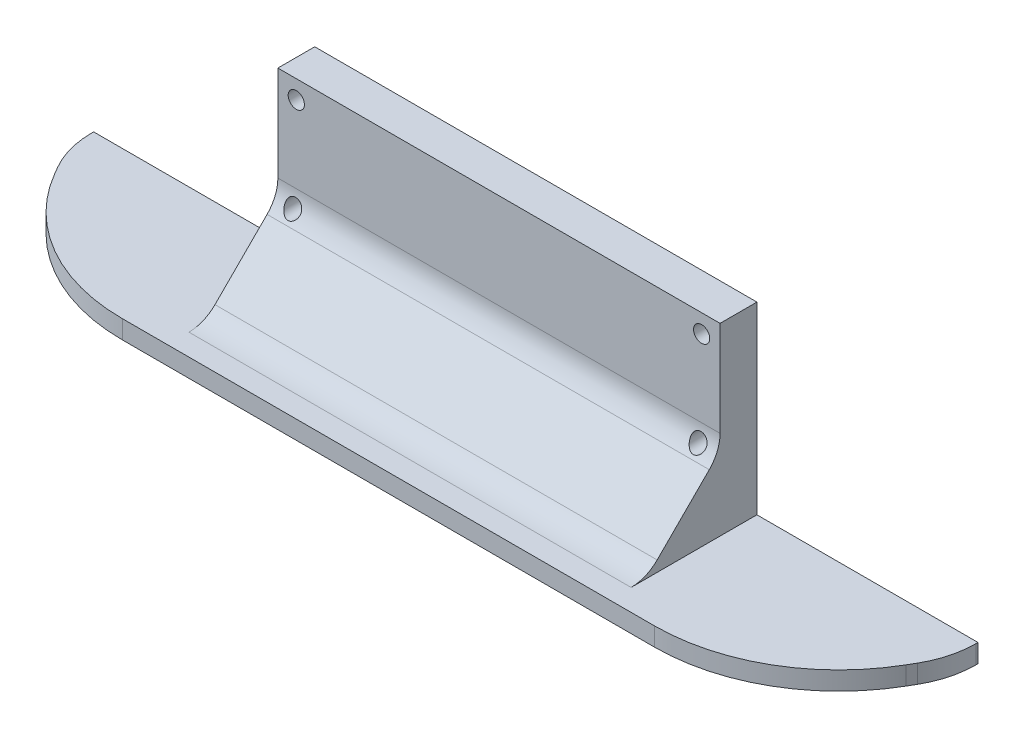
ISO-10303-21;
HEADER;
FILE_DESCRIPTION(('STEP AP214'),'2;1');
FILE_NAME('part.step','',(''),(''),'','','');
FILE_SCHEMA(('AUTOMOTIVE_DESIGN { 1 0 10303 214 1 1 1 1 }'));
ENDSEC;
DATA;
#1=APPLICATION_CONTEXT('core data for automotive mechanical design processes');
#2=APPLICATION_PROTOCOL_DEFINITION('international standard','automotive_design',2000,#1);
#3=PRODUCT_CONTEXT('',#1,'mechanical');
#4=PRODUCT('Part','Part','',(#3));
#5=PRODUCT_RELATED_PRODUCT_CATEGORY('part','',(#4));
#6=PRODUCT_DEFINITION_FORMATION('','',#4);
#7=PRODUCT_DEFINITION_CONTEXT('part definition',#1,'design');
#8=PRODUCT_DEFINITION('design','',#6,#7);
#9=PRODUCT_DEFINITION_SHAPE('','',#8);
#10=(LENGTH_UNIT() NAMED_UNIT(*) SI_UNIT(.MILLI.,.METRE.));
#11=(NAMED_UNIT(*) PLANE_ANGLE_UNIT() SI_UNIT($,.RADIAN.));
#12=(NAMED_UNIT(*) SI_UNIT($,.STERADIAN.) SOLID_ANGLE_UNIT());
#13=UNCERTAINTY_MEASURE_WITH_UNIT(LENGTH_MEASURE(1.E-05),#10,'distance_accuracy_value','');
#14=(GEOMETRIC_REPRESENTATION_CONTEXT(3) GLOBAL_UNCERTAINTY_ASSIGNED_CONTEXT((#13)) GLOBAL_UNIT_ASSIGNED_CONTEXT((#10,
#11,#12)) REPRESENTATION_CONTEXT('',''));
#15=CARTESIAN_POINT('',(0.,0.,0.));
#16=DIRECTION('',(0.,0.,1.));
#17=DIRECTION('',(1.,0.,0.));
#18=AXIS2_PLACEMENT_3D('',#15,#16,#17);
#19=CARTESIAN_POINT('',(0.,5.,0.));
#20=DIRECTION('',(0.,-1.,0.));
#21=DIRECTION('',(0.,0.,-1.));
#22=AXIS2_PLACEMENT_3D('',#19,#20,#21);
#23=PLANE('',#22);
#24=DIRECTION('',(1.,0.,0.));
#25=VECTOR('',#24,1.);
#26=CARTESIAN_POINT('',(-120.,5.,20.));
#27=LINE('',#26,#25);
#28=CARTESIAN_POINT('',(-72.2158524499378,5.,20.));
#29=VERTEX_POINT('',#28);
#30=CARTESIAN_POINT('',(72.2158524499378,5.,20.));
#31=VERTEX_POINT('',#30);
#32=EDGE_CURVE('E199',#29,#31,#27,.T.);
#33=ORIENTED_EDGE('',*,*,#32,.T.);
#34=CARTESIAN_POINT('',(72.2158524499379,5.,-30.));
#35=DIRECTION('',(0.,-1.,0.));
#36=DIRECTION('',(0.,0.,-1.));
#37=AXIS2_PLACEMENT_3D('',#34,#35,#36);
#38=CIRCLE('',#37,50.);
#39=CARTESIAN_POINT('',(115.51712263916,5.,-4.99999999999977));
#40=VERTEX_POINT('',#39);
#41=EDGE_CURVE('E385',#31,#40,#38,.F.);
#42=ORIENTED_EDGE('',*,*,#41,.T.);
#43=DIRECTION('',(-0.500000000000005,0.,0.866025403784436));
#44=VECTOR('',#43,1.);
#45=CARTESIAN_POINT('',(120.,5.,-12.7645713530755));
#46=LINE('',#45,#44);
#47=CARTESIAN_POINT('',(116.650635094611,5.,-6.96330116385355));
#48=VERTEX_POINT('',#47);
#49=EDGE_CURVE('E357',#40,#48,#46,.F.);
#50=ORIENTED_EDGE('',*,*,#49,.T.);
#51=CARTESIAN_POINT('',(95.0000000000001,5.,-19.4633011638537));
#52=DIRECTION('',(0.,-1.,0.));
#53=DIRECTION('',(0.,0.,-1.));
#54=AXIS2_PLACEMENT_3D('',#51,#52,#53);
#55=CIRCLE('',#54,25.);
#56=CARTESIAN_POINT('',(120.,5.,-19.4633011638537));
#57=VERTEX_POINT('',#56);
#58=EDGE_CURVE('E347',#48,#57,#55,.F.);
#59=ORIENTED_EDGE('',*,*,#58,.T.);
#60=DIRECTION('',(0.,0.,-1.));
#61=VECTOR('',#60,1.);
#62=CARTESIAN_POINT('',(120.,5.,20.));
#63=LINE('',#62,#61);
#64=CARTESIAN_POINT('',(120.,5.,-20.));
#65=VERTEX_POINT('',#64);
#66=EDGE_CURVE('E190',#57,#65,#63,.T.);
#67=ORIENTED_EDGE('',*,*,#66,.T.);
#68=DIRECTION('',(-1.,0.,0.));
#69=VECTOR('',#68,1.);
#70=CARTESIAN_POINT('',(-120.,5.,-20.));
#71=LINE('',#70,#69);
#72=CARTESIAN_POINT('',(60.,5.,-20.));
#73=VERTEX_POINT('',#72);
#74=EDGE_CURVE('E194',#65,#73,#71,.T.);
#75=ORIENTED_EDGE('',*,*,#74,.T.);
#76=DIRECTION('',(0.,0.,-1.));
#77=VECTOR('',#76,1.);
#78=CARTESIAN_POINT('',(60.,5.,-20.));
#79=LINE('',#78,#77);
#80=CARTESIAN_POINT('',(60.,5.,14.142135623731));
#81=VERTEX_POINT('',#80);
#82=EDGE_CURVE('E176',#81,#73,#79,.T.);
#83=ORIENTED_EDGE('',*,*,#82,.F.);
#84=DIRECTION('',(1.,0.,0.));
#85=VECTOR('',#84,1.);
#86=CARTESIAN_POINT('',(-60.,5.,14.142135623731));
#87=LINE('',#86,#85);
#88=CARTESIAN_POINT('',(-60.,5.,14.142135623731));
#89=VERTEX_POINT('',#88);
#90=EDGE_CURVE('E219',#81,#89,#87,.F.);
#91=ORIENTED_EDGE('',*,*,#90,.T.);
#92=DIRECTION('',(0.,0.,1.));
#93=VECTOR('',#92,1.);
#94=CARTESIAN_POINT('',(-60.,5.,-20.));
#95=LINE('',#94,#93);
#96=CARTESIAN_POINT('',(-60.,5.,-20.));
#97=VERTEX_POINT('',#96);
#98=EDGE_CURVE('E336',#97,#89,#95,.T.);
#99=ORIENTED_EDGE('',*,*,#98,.F.);
#100=CARTESIAN_POINT('',(-120.,5.,-20.));
#101=VERTEX_POINT('',#100);
#102=EDGE_CURVE('E192',#97,#101,#71,.T.);
#103=ORIENTED_EDGE('',*,*,#102,.T.);
#104=DIRECTION('',(0.,0.,1.));
#105=VECTOR('',#104,1.);
#106=CARTESIAN_POINT('',(-120.,5.,20.));
#107=LINE('',#106,#105);
#108=CARTESIAN_POINT('',(-120.,5.,-19.4633011638537));
#109=VERTEX_POINT('',#108);
#110=EDGE_CURVE('E196',#101,#109,#107,.T.);
#111=ORIENTED_EDGE('',*,*,#110,.T.);
#112=CARTESIAN_POINT('',(-95.,5.,-19.4633011638537));
#113=DIRECTION('',(0.,-1.,0.));
#114=DIRECTION('',(0.,0.,-1.));
#115=AXIS2_PLACEMENT_3D('',#112,#113,#114);
#116=CIRCLE('',#115,25.);
#117=CARTESIAN_POINT('',(-116.650635094611,5.,-6.96330116385371));
#118=VERTEX_POINT('',#117);
#119=EDGE_CURVE('E368',#109,#118,#116,.F.);
#120=ORIENTED_EDGE('',*,*,#119,.T.);
#121=DIRECTION('',(-0.500000000000001,0.,-0.866025403784438));
#122=VECTOR('',#121,1.);
#123=CARTESIAN_POINT('',(-120.,5.,-12.7645713530757));
#124=LINE('',#123,#122);
#125=CARTESIAN_POINT('',(-115.51712263916,5.,-4.99999999999993));
#126=VERTEX_POINT('',#125);
#127=EDGE_CURVE('E360',#118,#126,#124,.F.);
#128=ORIENTED_EDGE('',*,*,#127,.T.);
#129=CARTESIAN_POINT('',(-72.2158524499377,5.,-30.));
#130=DIRECTION('',(0.,-1.,0.));
#131=DIRECTION('',(0.,0.,-1.));
#132=AXIS2_PLACEMENT_3D('',#129,#130,#131);
#133=CIRCLE('',#132,50.);
#134=EDGE_CURVE('E383',#126,#29,#133,.F.);
#135=ORIENTED_EDGE('',*,*,#134,.T.);
#136=EDGE_LOOP('',(#33,#42,#50,#59,#67,#75,#83,#91,#99,#103,#111,#120,#128,#135));
#137=FACE_BOUND('',#136,.T.);
#138=ADVANCED_FACE('F35',(#137),#23,.F.);
#139=CARTESIAN_POINT('',(120.,5.,20.));
#140=DIRECTION('',(-1.,0.,0.));
#141=DIRECTION('',(0.,0.,1.));
#142=AXIS2_PLACEMENT_3D('',#139,#140,#141);
#143=PLANE('',#142);
#144=ORIENTED_EDGE('',*,*,#66,.F.);
#145=DIRECTION('',(0.,1.,0.));
#146=VECTOR('',#145,1.);
#147=CARTESIAN_POINT('',(120.,0.,-19.4633011638537));
#148=LINE('',#147,#146);
#149=CARTESIAN_POINT('',(120.,0.,-19.4633011638537));
#150=VERTEX_POINT('',#149);
#151=EDGE_CURVE('E350',#57,#150,#148,.F.);
#152=ORIENTED_EDGE('',*,*,#151,.T.);
#153=DIRECTION('',(0.,0.,-1.));
#154=VECTOR('',#153,1.);
#155=CARTESIAN_POINT('',(120.,0.,20.));
#156=LINE('',#155,#154);
#157=CARTESIAN_POINT('',(120.,0.,-20.));
#158=VERTEX_POINT('',#157);
#159=EDGE_CURVE('E182',#150,#158,#156,.T.);
#160=ORIENTED_EDGE('',*,*,#159,.T.);
#161=DIRECTION('',(0.,-1.,0.));
#162=VECTOR('',#161,1.);
#163=CARTESIAN_POINT('',(120.,5.,-20.));
#164=LINE('',#163,#162);
#165=EDGE_CURVE('E211',#65,#158,#164,.T.);
#166=ORIENTED_EDGE('',*,*,#165,.F.);
#167=EDGE_LOOP('',(#144,#152,#160,#166));
#168=FACE_BOUND('',#167,.T.);
#169=ADVANCED_FACE('F289',(#168),#143,.F.);
#170=CARTESIAN_POINT('',(-120.,5.,-20.));
#171=DIRECTION('',(0.,0.,1.));
#172=DIRECTION('',(1.,0.,0.));
#173=AXIS2_PLACEMENT_3D('',#170,#171,#172);
#174=PLANE('',#173);
#175=CARTESIAN_POINT('',(55.,50.,-20.));
#176=DIRECTION('',(0.,0.,1.));
#177=DIRECTION('',(1.,0.,0.));
#178=AXIS2_PLACEMENT_3D('',#175,#176,#177);
#179=CIRCLE('',#178,2.2);
#180=CARTESIAN_POINT('',(57.2,50.,-20.));
#181=VERTEX_POINT('',#180);
#182=EDGE_CURVE('E583',#181,#181,#179,.T.);
#183=ORIENTED_EDGE('',*,*,#182,.T.);
#184=EDGE_LOOP('',(#183));
#185=FACE_BOUND('',#184,.T.);
#186=CARTESIAN_POINT('',(-55.,25.,-20.));
#187=DIRECTION('',(0.,0.,1.));
#188=DIRECTION('',(1.,0.,0.));
#189=AXIS2_PLACEMENT_3D('',#186,#187,#188);
#190=CIRCLE('',#189,2.2);
#191=CARTESIAN_POINT('',(-52.8,25.,-20.));
#192=VERTEX_POINT('',#191);
#193=EDGE_CURVE('E584',#192,#192,#190,.T.);
#194=ORIENTED_EDGE('',*,*,#193,.T.);
#195=EDGE_LOOP('',(#194));
#196=FACE_BOUND('',#195,.T.);
#197=CARTESIAN_POINT('',(55.,25.,-20.));
#198=DIRECTION('',(0.,0.,1.));
#199=DIRECTION('',(1.,0.,0.));
#200=AXIS2_PLACEMENT_3D('',#197,#198,#199);
#201=CIRCLE('',#200,2.2);
#202=CARTESIAN_POINT('',(57.2,25.,-20.));
#203=VERTEX_POINT('',#202);
#204=EDGE_CURVE('E587',#203,#203,#201,.T.);
#205=ORIENTED_EDGE('',*,*,#204,.T.);
#206=EDGE_LOOP('',(#205));
#207=FACE_BOUND('',#206,.T.);
#208=CARTESIAN_POINT('',(-55.,50.,-20.));
#209=DIRECTION('',(0.,0.,1.));
#210=DIRECTION('',(1.,0.,0.));
#211=AXIS2_PLACEMENT_3D('',#208,#209,#210);
#212=CIRCLE('',#211,2.2);
#213=CARTESIAN_POINT('',(-52.8,50.,-20.));
#214=VERTEX_POINT('',#213);
#215=EDGE_CURVE('E246',#214,#214,#212,.T.);
#216=ORIENTED_EDGE('',*,*,#215,.T.);
#217=EDGE_LOOP('',(#216));
#218=FACE_BOUND('',#217,.T.);
#219=DIRECTION('',(-1.,0.,0.));
#220=VECTOR('',#219,1.);
#221=CARTESIAN_POINT('',(-120.,0.,-20.));
#222=LINE('',#221,#220);
#223=CARTESIAN_POINT('',(-120.,0.,-20.));
#224=VERTEX_POINT('',#223);
#225=EDGE_CURVE('E184',#158,#224,#222,.T.);
#226=ORIENTED_EDGE('',*,*,#225,.T.);
#227=DIRECTION('',(0.,-1.,0.));
#228=VECTOR('',#227,1.);
#229=CARTESIAN_POINT('',(-120.,5.,-20.));
#230=LINE('',#229,#228);
#231=EDGE_CURVE('E201',#101,#224,#230,.T.);
#232=ORIENTED_EDGE('',*,*,#231,.F.);
#233=ORIENTED_EDGE('',*,*,#102,.F.);
#234=DIRECTION('',(0.,-1.,0.));
#235=VECTOR('',#234,1.);
#236=CARTESIAN_POINT('',(-60.,55.,-20.));
#237=LINE('',#236,#235);
#238=CARTESIAN_POINT('',(-60.,55.,-20.));
#239=VERTEX_POINT('',#238);
#240=EDGE_CURVE('E333',#239,#97,#237,.T.);
#241=ORIENTED_EDGE('',*,*,#240,.F.);
#242=DIRECTION('',(-1.,0.,0.));
#243=VECTOR('',#242,1.);
#244=CARTESIAN_POINT('',(-60.,55.,-20.));
#245=LINE('',#244,#243);
#246=CARTESIAN_POINT('',(60.,55.,-20.));
#247=VERTEX_POINT('',#246);
#248=EDGE_CURVE('E172',#247,#239,#245,.T.);
#249=ORIENTED_EDGE('',*,*,#248,.F.);
#250=DIRECTION('',(0.,-1.,0.));
#251=VECTOR('',#250,1.);
#252=CARTESIAN_POINT('',(60.,55.,-20.));
#253=LINE('',#252,#251);
#254=EDGE_CURVE('E186',#247,#73,#253,.T.);
#255=ORIENTED_EDGE('',*,*,#254,.T.);
#256=ORIENTED_EDGE('',*,*,#74,.F.);
#257=ORIENTED_EDGE('',*,*,#165,.T.);
#258=EDGE_LOOP('',(#226,#232,#233,#241,#249,#255,#256,#257));
#259=FACE_BOUND('',#258,.T.);
#260=ADVANCED_FACE('F300',(#185,#196,#207,#218,#259),#174,.F.);
#261=CARTESIAN_POINT('',(-120.,5.,20.));
#262=DIRECTION('',(1.,0.,0.));
#263=DIRECTION('',(0.,0.,-1.));
#264=AXIS2_PLACEMENT_3D('',#261,#262,#263);
#265=PLANE('',#264);
#266=DIRECTION('',(0.,0.,1.));
#267=VECTOR('',#266,1.);
#268=CARTESIAN_POINT('',(-120.,0.,20.));
#269=LINE('',#268,#267);
#270=CARTESIAN_POINT('',(-120.,0.,-19.4633011638537));
#271=VERTEX_POINT('',#270);
#272=EDGE_CURVE('E204',#224,#271,#269,.T.);
#273=ORIENTED_EDGE('',*,*,#272,.T.);
#274=DIRECTION('',(0.,-1.,0.));
#275=VECTOR('',#274,1.);
#276=CARTESIAN_POINT('',(-120.,5.,-19.4633011638537));
#277=LINE('',#276,#275);
#278=EDGE_CURVE('E371',#271,#109,#277,.F.);
#279=ORIENTED_EDGE('',*,*,#278,.T.);
#280=ORIENTED_EDGE('',*,*,#110,.F.);
#281=ORIENTED_EDGE('',*,*,#231,.T.);
#282=EDGE_LOOP('',(#273,#279,#280,#281));
#283=FACE_BOUND('',#282,.T.);
#284=ADVANCED_FACE('F296',(#283),#265,.F.);
#285=CARTESIAN_POINT('',(-120.,5.,20.));
#286=DIRECTION('',(0.,0.,-1.));
#287=DIRECTION('',(-1.,0.,0.));
#288=AXIS2_PLACEMENT_3D('',#285,#286,#287);
#289=PLANE('',#288);
#290=DIRECTION('',(1.,0.,0.));
#291=VECTOR('',#290,1.);
#292=CARTESIAN_POINT('',(-120.,0.,20.));
#293=LINE('',#292,#291);
#294=CARTESIAN_POINT('',(-72.2158524499378,0.,20.));
#295=VERTEX_POINT('',#294);
#296=CARTESIAN_POINT('',(72.2158524499378,0.,20.));
#297=VERTEX_POINT('',#296);
#298=EDGE_CURVE('E193',#295,#297,#293,.T.);
#299=ORIENTED_EDGE('',*,*,#298,.T.);
#300=DIRECTION('',(0.,-1.,0.));
#301=VECTOR('',#300,1.);
#302=CARTESIAN_POINT('',(72.2158524499379,5.,20.));
#303=LINE('',#302,#301);
#304=EDGE_CURVE('E380',#297,#31,#303,.F.);
#305=ORIENTED_EDGE('',*,*,#304,.T.);
#306=ORIENTED_EDGE('',*,*,#32,.F.);
#307=DIRECTION('',(0.,1.,0.));
#308=VECTOR('',#307,1.);
#309=CARTESIAN_POINT('',(-72.2158524499377,5.,20.));
#310=LINE('',#309,#308);
#311=EDGE_CURVE('E377',#29,#295,#310,.F.);
#312=ORIENTED_EDGE('',*,*,#311,.T.);
#313=EDGE_LOOP('',(#299,#305,#306,#312));
#314=FACE_BOUND('',#313,.T.);
#315=ADVANCED_FACE('F293',(#314),#289,.F.);
#316=CARTESIAN_POINT('',(0.,0.,0.));
#317=DIRECTION('',(0.,-1.,0.));
#318=DIRECTION('',(0.,0.,-1.));
#319=AXIS2_PLACEMENT_3D('',#316,#317,#318);
#320=PLANE('',#319);
#321=DIRECTION('',(0.500000000000005,0.,-0.866025403784436));
#322=VECTOR('',#321,1.);
#323=CARTESIAN_POINT('',(84.4727784699082,0.,48.7703813887977));
#324=LINE('',#323,#322);
#325=CARTESIAN_POINT('',(116.650635094611,0.,-6.96330116385355));
#326=VERTEX_POINT('',#325);
#327=CARTESIAN_POINT('',(115.51712263916,0.,-4.99999999999978));
#328=VERTEX_POINT('',#327);
#329=EDGE_CURVE('E389',#326,#328,#324,.F.);
#330=ORIENTED_EDGE('',*,*,#329,.T.);
#331=CARTESIAN_POINT('',(72.2158524499379,0.,-30.));
#332=DIRECTION('',(0.,-1.,0.));
#333=DIRECTION('',(0.,0.,-1.));
#334=AXIS2_PLACEMENT_3D('',#331,#332,#333);
#335=CIRCLE('',#334,50.);
#336=EDGE_CURVE('E43',#328,#297,#335,.T.);
#337=ORIENTED_EDGE('',*,*,#336,.T.);
#338=ORIENTED_EDGE('',*,*,#298,.F.);
#339=CARTESIAN_POINT('',(-72.2158524499377,0.,-30.));
#340=DIRECTION('',(0.,-1.,0.));
#341=DIRECTION('',(0.,0.,-1.));
#342=AXIS2_PLACEMENT_3D('',#339,#340,#341);
#343=CIRCLE('',#342,50.);
#344=CARTESIAN_POINT('',(-115.51712263916,0.,-4.99999999999993));
#345=VERTEX_POINT('',#344);
#346=EDGE_CURVE('E50',#295,#345,#343,.T.);
#347=ORIENTED_EDGE('',*,*,#346,.T.);
#348=DIRECTION('',(0.500000000000001,0.,0.866025403784438));
#349=VECTOR('',#348,1.);
#350=CARTESIAN_POINT('',(-84.4727784699085,0.,48.7703813887975));
#351=LINE('',#350,#349);
#352=CARTESIAN_POINT('',(-116.650635094611,0.,-6.96330116385371));
#353=VERTEX_POINT('',#352);
#354=EDGE_CURVE('E236',#345,#353,#351,.F.);
#355=ORIENTED_EDGE('',*,*,#354,.T.);
#356=CARTESIAN_POINT('',(-95.,0.,-19.4633011638537));
#357=DIRECTION('',(0.,-1.,0.));
#358=DIRECTION('',(0.,0.,-1.));
#359=AXIS2_PLACEMENT_3D('',#356,#357,#358);
#360=CIRCLE('',#359,25.);
#361=EDGE_CURVE('E356',#353,#271,#360,.T.);
#362=ORIENTED_EDGE('',*,*,#361,.T.);
#363=ORIENTED_EDGE('',*,*,#272,.F.);
#364=ORIENTED_EDGE('',*,*,#225,.F.);
#365=ORIENTED_EDGE('',*,*,#159,.F.);
#366=CARTESIAN_POINT('',(95.0000000000001,0.,-19.4633011638537));
#367=DIRECTION('',(0.,-1.,0.));
#368=DIRECTION('',(0.,0.,-1.));
#369=AXIS2_PLACEMENT_3D('',#366,#367,#368);
#370=CIRCLE('',#369,25.);
#371=EDGE_CURVE('E355',#150,#326,#370,.T.);
#372=ORIENTED_EDGE('',*,*,#371,.T.);
#373=EDGE_LOOP('',(#330,#337,#338,#347,#355,#362,#363,#364,#365,#372));
#374=FACE_BOUND('',#373,.T.);
#375=ADVANCED_FACE('F286',(#374),#320,.T.);
#376=CARTESIAN_POINT('',(-60.,55.,-20.));
#377=DIRECTION('',(1.,0.,0.));
#378=DIRECTION('',(0.,0.,-1.));
#379=AXIS2_PLACEMENT_3D('',#376,#377,#378);
#380=PLANE('',#379);
#381=ORIENTED_EDGE('',*,*,#98,.T.);
#382=CARTESIAN_POINT('',(-60.,15.,14.142135623731));
#383=DIRECTION('',(1.,0.,0.));
#384=DIRECTION('',(0.,0.,-1.));
#385=AXIS2_PLACEMENT_3D('',#382,#383,#384);
#386=CIRCLE('',#385,10.);
#387=CARTESIAN_POINT('',(-60.,7.92893218813455,7.07106781186546));
#388=VERTEX_POINT('',#387);
#389=EDGE_CURVE('E228',#89,#388,#386,.T.);
#390=ORIENTED_EDGE('',*,*,#389,.T.);
#391=DIRECTION('',(0.,-0.707106781186551,0.707106781186544));
#392=VECTOR('',#391,1.);
#393=CARTESIAN_POINT('',(-60.,45.0000000000002,-29.9999999999999));
#394=LINE('',#393,#392);
#395=CARTESIAN_POINT('',(-60.,22.0710678118657,-7.07106781186551));
#396=VERTEX_POINT('',#395);
#397=EDGE_CURVE('E217',#388,#396,#394,.F.);
#398=ORIENTED_EDGE('',*,*,#397,.T.);
#399=CARTESIAN_POINT('',(-60.,29.1421356237311,0.));
#400=DIRECTION('',(1.,0.,0.));
#401=DIRECTION('',(0.,0.,-1.));
#402=AXIS2_PLACEMENT_3D('',#399,#400,#401);
#403=CIRCLE('',#402,10.);
#404=CARTESIAN_POINT('',(-60.,29.1421356237311,-10.));
#405=VERTEX_POINT('',#404);
#406=EDGE_CURVE('E181',#396,#405,#403,.T.);
#407=ORIENTED_EDGE('',*,*,#406,.T.);
#408=DIRECTION('',(0.,-1.,0.));
#409=VECTOR('',#408,1.);
#410=CARTESIAN_POINT('',(-60.,55.,-10.));
#411=LINE('',#410,#409);
#412=CARTESIAN_POINT('',(-60.,55.,-10.));
#413=VERTEX_POINT('',#412);
#414=EDGE_CURVE('E160',#413,#405,#411,.T.);
#415=ORIENTED_EDGE('',*,*,#414,.F.);
#416=DIRECTION('',(0.,0.,1.));
#417=VECTOR('',#416,1.);
#418=CARTESIAN_POINT('',(-60.,55.,-20.));
#419=LINE('',#418,#417);
#420=EDGE_CURVE('E167',#239,#413,#419,.T.);
#421=ORIENTED_EDGE('',*,*,#420,.F.);
#422=ORIENTED_EDGE('',*,*,#240,.T.);
#423=EDGE_LOOP('',(#381,#390,#398,#407,#415,#421,#422));
#424=FACE_BOUND('',#423,.T.);
#425=ADVANCED_FACE('F178',(#424),#380,.F.);
#426=CARTESIAN_POINT('',(-60.,55.,-10.));
#427=DIRECTION('',(0.,0.,-1.));
#428=DIRECTION('',(-1.,0.,0.));
#429=AXIS2_PLACEMENT_3D('',#426,#427,#428);
#430=PLANE('',#429);
#431=CARTESIAN_POINT('',(55.,50.,-10.));
#432=DIRECTION('',(0.,0.,-1.));
#433=DIRECTION('',(-1.,0.,0.));
#434=AXIS2_PLACEMENT_3D('',#431,#432,#433);
#435=CIRCLE('',#434,2.2);
#436=CARTESIAN_POINT('',(52.8,50.,-10.));
#437=VERTEX_POINT('',#436);
#438=EDGE_CURVE('E338',#437,#437,#435,.T.);
#439=ORIENTED_EDGE('',*,*,#438,.T.);
#440=EDGE_LOOP('',(#439));
#441=FACE_BOUND('',#440,.T.);
#442=CARTESIAN_POINT('',(-55.,50.,-10.));
#443=DIRECTION('',(0.,0.,-1.));
#444=DIRECTION('',(-1.,0.,0.));
#445=AXIS2_PLACEMENT_3D('',#442,#443,#444);
#446=CIRCLE('',#445,2.2);
#447=CARTESIAN_POINT('',(-57.2,50.,-10.));
#448=VERTEX_POINT('',#447);
#449=EDGE_CURVE('E400',#448,#448,#446,.T.);
#450=ORIENTED_EDGE('',*,*,#449,.T.);
#451=EDGE_LOOP('',(#450));
#452=FACE_BOUND('',#451,.T.);
#453=ORIENTED_EDGE('',*,*,#414,.T.);
#454=DIRECTION('',(-1.,0.,0.));
#455=VECTOR('',#454,1.);
#456=CARTESIAN_POINT('',(60.,29.1421356237311,-10.));
#457=LINE('',#456,#455);
#458=CARTESIAN_POINT('',(60.,29.1421356237311,-10.));
#459=VERTEX_POINT('',#458);
#460=EDGE_CURVE('E226',#405,#459,#457,.F.);
#461=ORIENTED_EDGE('',*,*,#460,.T.);
#462=DIRECTION('',(0.,-1.,0.));
#463=VECTOR('',#462,1.);
#464=CARTESIAN_POINT('',(60.,55.,-10.));
#465=LINE('',#464,#463);
#466=CARTESIAN_POINT('',(60.,55.,-10.));
#467=VERTEX_POINT('',#466);
#468=EDGE_CURVE('E163',#467,#459,#465,.T.);
#469=ORIENTED_EDGE('',*,*,#468,.F.);
#470=DIRECTION('',(1.,0.,0.));
#471=VECTOR('',#470,1.);
#472=CARTESIAN_POINT('',(-60.,55.,-10.));
#473=LINE('',#472,#471);
#474=EDGE_CURVE('E155',#413,#467,#473,.T.);
#475=ORIENTED_EDGE('',*,*,#474,.F.);
#476=EDGE_LOOP('',(#453,#461,#469,#475));
#477=FACE_BOUND('',#476,.T.);
#478=ADVANCED_FACE('F157',(#441,#452,#477),#430,.F.);
#479=CARTESIAN_POINT('',(60.,55.,-20.));
#480=DIRECTION('',(-1.,0.,0.));
#481=DIRECTION('',(0.,0.,1.));
#482=AXIS2_PLACEMENT_3D('',#479,#480,#481);
#483=PLANE('',#482);
#484=ORIENTED_EDGE('',*,*,#82,.T.);
#485=ORIENTED_EDGE('',*,*,#254,.F.);
#486=DIRECTION('',(0.,0.,-1.));
#487=VECTOR('',#486,1.);
#488=CARTESIAN_POINT('',(60.,55.,-20.));
#489=LINE('',#488,#487);
#490=EDGE_CURVE('E166',#467,#247,#489,.T.);
#491=ORIENTED_EDGE('',*,*,#490,.F.);
#492=ORIENTED_EDGE('',*,*,#468,.T.);
#493=CARTESIAN_POINT('',(60.,29.1421356237311,0.));
#494=DIRECTION('',(-1.,0.,0.));
#495=DIRECTION('',(0.,0.,1.));
#496=AXIS2_PLACEMENT_3D('',#493,#494,#495);
#497=CIRCLE('',#496,10.);
#498=CARTESIAN_POINT('',(60.,22.0710678118657,-7.07106781186551));
#499=VERTEX_POINT('',#498);
#500=EDGE_CURVE('E233',#459,#499,#497,.T.);
#501=ORIENTED_EDGE('',*,*,#500,.T.);
#502=DIRECTION('',(0.,0.707106781186551,-0.707106781186544));
#503=VECTOR('',#502,1.);
#504=CARTESIAN_POINT('',(60.,45.0000000000002,-29.9999999999999));
#505=LINE('',#504,#503);
#506=CARTESIAN_POINT('',(60.,7.92893218813455,7.07106781186546));
#507=VERTEX_POINT('',#506);
#508=EDGE_CURVE('E214',#499,#507,#505,.F.);
#509=ORIENTED_EDGE('',*,*,#508,.T.);
#510=CARTESIAN_POINT('',(60.,15.,14.142135623731));
#511=DIRECTION('',(-1.,0.,0.));
#512=DIRECTION('',(0.,0.,1.));
#513=AXIS2_PLACEMENT_3D('',#510,#511,#512);
#514=CIRCLE('',#513,10.);
#515=EDGE_CURVE('E230',#507,#81,#514,.T.);
#516=ORIENTED_EDGE('',*,*,#515,.T.);
#517=EDGE_LOOP('',(#484,#485,#491,#492,#501,#509,#516));
#518=FACE_BOUND('',#517,.T.);
#519=ADVANCED_FACE('F277',(#518),#483,.F.);
#520=CARTESIAN_POINT('',(0.,55.,0.));
#521=DIRECTION('',(0.,1.,0.));
#522=DIRECTION('',(0.,0.,1.));
#523=AXIS2_PLACEMENT_3D('',#520,#521,#522);
#524=PLANE('',#523);
#525=ORIENTED_EDGE('',*,*,#420,.T.);
#526=ORIENTED_EDGE('',*,*,#474,.T.);
#527=ORIENTED_EDGE('',*,*,#490,.T.);
#528=ORIENTED_EDGE('',*,*,#248,.T.);
#529=EDGE_LOOP('',(#525,#526,#527,#528));
#530=FACE_BOUND('',#529,.T.);
#531=ADVANCED_FACE('F170',(#530),#524,.T.);
#532=CARTESIAN_POINT('',(-60.,25.0000000000002,-10.));
#533=DIRECTION('',(0.,0.707106781186544,0.707106781186551));
#534=DIRECTION('',(-1.,0.,0.));
#535=AXIS2_PLACEMENT_3D('',#532,#533,#534);
#536=PLANE('',#535);
#537=ORIENTED_EDGE('',*,*,#397,.F.);
#538=DIRECTION('',(-1.,0.,0.));
#539=VECTOR('',#538,1.);
#540=CARTESIAN_POINT('',(60.,7.92893218813456,7.07106781186546));
#541=LINE('',#540,#539);
#542=EDGE_CURVE('E224',#388,#507,#541,.F.);
#543=ORIENTED_EDGE('',*,*,#542,.T.);
#544=ORIENTED_EDGE('',*,*,#508,.F.);
#545=DIRECTION('',(1.,0.,0.));
#546=VECTOR('',#545,1.);
#547=CARTESIAN_POINT('',(-60.,22.0710678118657,-7.07106781186551));
#548=LINE('',#547,#546);
#549=EDGE_CURVE('E222',#499,#396,#548,.F.);
#550=ORIENTED_EDGE('',*,*,#549,.T.);
#551=EDGE_LOOP('',(#537,#543,#544,#550));
#552=FACE_BOUND('',#551,.T.);
#553=ADVANCED_FACE('F276',(#552),#536,.T.);
#554=CARTESIAN_POINT('',(0.,15.,14.142135623731));
#555=DIRECTION('',(-1.,0.,0.));
#556=DIRECTION('',(0.,0.,1.));
#557=AXIS2_PLACEMENT_3D('',#554,#555,#556);
#558=CYLINDRICAL_SURFACE('',#557,10.);
#559=ORIENTED_EDGE('',*,*,#515,.F.);
#560=ORIENTED_EDGE('',*,*,#542,.F.);
#561=ORIENTED_EDGE('',*,*,#389,.F.);
#562=ORIENTED_EDGE('',*,*,#90,.F.);
#563=EDGE_LOOP('',(#559,#560,#561,#562));
#564=FACE_BOUND('',#563,.T.);
#565=ADVANCED_FACE('F313',(#564),#558,.F.);
#566=CARTESIAN_POINT('',(-60.,29.1421356237311,0.));
#567=DIRECTION('',(1.,0.,0.));
#568=DIRECTION('',(0.,0.,-1.));
#569=AXIS2_PLACEMENT_3D('',#566,#567,#568);
#570=CYLINDRICAL_SURFACE('',#569,10.);
#571=CARTESIAN_POINT('',(-52.8,25.,-9.10179721124448));
#572=CARTESIAN_POINT('',(-52.800002709933,24.8607256539564,-9.03841097413791));
#573=CARTESIAN_POINT('',(-52.8132479920078,24.7228868321372,-8.97178663107195));
#574=CARTESIAN_POINT('',(-52.8644170723492,24.4540574097546,-8.83429645679175));
#575=CARTESIAN_POINT('',(-52.9023619672902,24.3230727669727,-8.76342704676698));
#576=CARTESIAN_POINT('',(-53.0010216321716,24.0713948644641,-8.62023725633846));
#577=CARTESIAN_POINT('',(-53.061673317764,23.9506742189442,-8.54792141649536));
#578=CARTESIAN_POINT('',(-53.2044501138979,23.7216303984507,-8.40454637832238));
#579=CARTESIAN_POINT('',(-53.2865930712492,23.6133176352402,-8.33348827705279));
#580=CARTESIAN_POINT('',(-53.4745071691555,23.4085031317605,-8.19398054182154));
#581=CARTESIAN_POINT('',(-53.5809896942511,23.3125313522474,-8.12570297216303));
#582=CARTESIAN_POINT('',(-53.8146661944024,23.141006703164,-7.99985910072293));
#583=CARTESIAN_POINT('',(-53.9418038248189,23.0653997318073,-7.94226454758177));
#584=CARTESIAN_POINT('',(-54.1680814824543,22.9609350271285,-7.86101612625667));
#585=CARTESIAN_POINT('',(-54.2621797764288,22.9249122126466,-7.8324684390066));
#586=CARTESIAN_POINT('',(-54.4566667220559,22.8657356073861,-7.78512976437183));
#587=CARTESIAN_POINT('',(-54.5570481010306,22.8425672332714,-7.76632772217311));
#588=CARTESIAN_POINT('',(-54.7621320568255,22.8104240738985,-7.74014728958749));
#589=CARTESIAN_POINT('',(-54.8668551394636,22.8015270494211,-7.73283148921928));
#590=CARTESIAN_POINT('',(-55.0766343738112,22.7988358557917,-7.73062443644603));
#591=CARTESIAN_POINT('',(-55.1816905022481,22.8050406536102,-7.73573233420658));
#592=CARTESIAN_POINT('',(-55.3801021572162,22.8309637064518,-7.75689012137169));
#593=CARTESIAN_POINT('',(-55.4737131304283,22.8495384825859,-7.77201356609514));
#594=CARTESIAN_POINT('',(-55.6560412818022,22.89797342545,-7.81097925505866));
#595=CARTESIAN_POINT('',(-55.744757042985,22.9278368403797,-7.83482400870944));
#596=CARTESIAN_POINT('',(-55.9224395603026,23.0002462003884,-7.89173388018523));
#597=CARTESIAN_POINT('',(-56.0108910376479,23.0435967954772,-7.92537112760631));
#598=CARTESIAN_POINT('',(-56.1793369552433,23.1402662372846,-7.99882809993998));
#599=CARTESIAN_POINT('',(-56.2593270144345,23.1935902087385,-8.03865100150746));
#600=CARTESIAN_POINT('',(-56.4253498537898,23.3203134865624,-8.13103181709844));
#601=CARTESIAN_POINT('',(-56.5094121787274,23.3955958654211,-8.18454633422967));
#602=CARTESIAN_POINT('',(-56.6640462891413,23.5565915783209,-8.29525574910597));
#603=CARTESIAN_POINT('',(-56.7346077377252,23.642312823318,-8.35245342241916));
#604=CARTESIAN_POINT('',(-56.8738143158966,23.8398056157046,-8.47947746430751));
#605=CARTESIAN_POINT('',(-56.9395436348562,23.9534311733377,-8.54963704025394));
#606=CARTESIAN_POINT('',(-57.0500031389348,24.1908973711472,-8.68931774275884));
#607=CARTESIAN_POINT('',(-57.0947216697122,24.3147436359161,-8.75883849406124));
#608=CARTESIAN_POINT('',(-57.1638273340751,24.578533969853,-8.89928496537745));
#609=CARTESIAN_POINT('',(-57.1866757389126,24.7190009993711,-8.96999996954637));
#610=CARTESIAN_POINT('',(-57.2046366808587,25.004638240658,-9.10527539959826));
#611=CARTESIAN_POINT('',(-57.1997615161724,25.1498063386158,-9.16983854153245));
#612=CARTESIAN_POINT('',(-57.1618907362511,25.4299236225296,-9.28660076787196));
#613=CARTESIAN_POINT('',(-57.1308099127481,25.5649029666447,-9.33933955424478));
#614=CARTESIAN_POINT('',(-57.0424832537709,25.8292362728615,-9.43633835561549));
#615=CARTESIAN_POINT('',(-56.9852573735896,25.9585944430273,-9.48060480065674));
#616=CARTESIAN_POINT('',(-56.8527873183412,26.1930621520839,-9.5559706597355));
#617=CARTESIAN_POINT('',(-56.7800304641838,26.2992948982339,-9.58795992463268));
#618=CARTESIAN_POINT('',(-56.6159163955731,26.4984801001093,-9.64478192200635));
#619=CARTESIAN_POINT('',(-56.5245660266864,26.5914374220704,-9.66961728022938));
#620=CARTESIAN_POINT('',(-56.332166714646,26.755074492335,-9.71126396952327));
#621=CARTESIAN_POINT('',(-56.2320754332523,26.8267807722236,-9.72847854300167));
#622=CARTESIAN_POINT('',(-56.020757162248,26.9527357707245,-9.75759815482414));
#623=CARTESIAN_POINT('',(-55.9095316043171,27.006986730025,-9.76950387472594));
#624=CARTESIAN_POINT('',(-55.681368074773,27.0953349670332,-9.78839218336039));
#625=CARTESIAN_POINT('',(-55.564575421519,27.1297894160059,-9.79546249059845));
#626=CARTESIAN_POINT('',(-55.3267373712519,27.1789878473823,-9.80544176411708));
#627=CARTESIAN_POINT('',(-55.205692037316,27.1937321220072,-9.80835079209242));
#628=CARTESIAN_POINT('',(-54.9630176083195,27.2030322677964,-9.81019376218002));
#629=CARTESIAN_POINT('',(-54.8413899513873,27.1976243348963,-9.80913483123368));
#630=CARTESIAN_POINT('',(-54.6007857586335,27.1668724358122,-9.80298815610083));
#631=CARTESIAN_POINT('',(-54.4818092025801,27.1415286218216,-9.79790044267063));
#632=CARTESIAN_POINT('',(-54.2498731770694,27.0717088998354,-9.7833835908444));
#633=CARTESIAN_POINT('',(-54.1369143513403,27.0272309496241,-9.77395398902439));
#634=CARTESIAN_POINT('',(-53.9202330255512,26.9205942345755,-9.75026777696314));
#635=CARTESIAN_POINT('',(-53.8165101112864,26.8584362631624,-9.73601138332778));
#636=CARTESIAN_POINT('',(-53.6211554566086,26.7184956985398,-9.70212013282177));
#637=CARTESIAN_POINT('',(-53.5295269313915,26.6407089643558,-9.68248385000093));
#638=CARTESIAN_POINT('',(-53.3608075797569,26.4721643943899,-9.63736718195686));
#639=CARTESIAN_POINT('',(-53.2837168811878,26.381406444549,-9.61188674534341));
#640=CARTESIAN_POINT('',(-53.1451661669719,26.1890264216644,-9.55454358467979));
#641=CARTESIAN_POINT('',(-53.083869348922,26.0873052146826,-9.52261986576102));
#642=CARTESIAN_POINT('',(-52.9789938354394,25.8771167605979,-9.4526141298802));
#643=CARTESIAN_POINT('',(-52.9354146371754,25.768649705045,-9.41453228773043));
#644=CARTESIAN_POINT('',(-52.8669033439993,25.5502399336512,-9.33335995906226));
#645=CARTESIAN_POINT('',(-52.8416481276216,25.4403594260411,-9.29037256229791));
#646=CARTESIAN_POINT('',(-52.8081915666537,25.2200232872967,-9.19952531854849));
#647=CARTESIAN_POINT('',(-52.7999978680899,25.1095674205375,-9.15166329710048));
#648=CARTESIAN_POINT('',(-52.8,25.,-9.10179721124448));
#649=B_SPLINE_CURVE_WITH_KNOTS('',3,(#571,#572,#573,#574,#575,#576,#577,#578,#579,#580,#581,
#582,#583,#584,#585,#586,#587,#588,#589,#590,#591,#592,#593,#594,#595,#596,#597,#598,#599,#600,
#601,#602,#603,#604,#605,#606,#607,#608,#609,#610,#611,#612,#613,#614,#615,#616,#617,#618,#619,
#620,#621,#622,#623,#624,#625,#626,#627,#628,#629,#630,#631,#632,#633,#634,#635,#636,#637,#638,
#639,#640,#641,#642,#643,#644,#645,#646,#647,#648),.UNSPECIFIED.,.T.,.F.,(4,2,2,2,2,2,2,2,2,2,2,
2,2,2,2,2,2,2,2,2,2,2,2,2,2,2,2,2,2,2,2,2,2,2,2,2,2,2,4),(0.,0.458592588127938,0.91757738871635,
1.37529638108318,1.83339668618813,2.30714821199545,2.77962845531596,3.09257184355337,
3.40515946837728,3.71944458414402,4.03370820206141,4.32233946686761,4.61105384590792,
4.92218379855899,5.23347406413016,5.60677465843286,5.98035993505589,6.42498415013894,
6.86985470071252,7.34412167996586,7.81817829029458,8.26032752393931,8.70213984818447,
9.09808547623678,9.49388559198117,9.86504833158637,10.2361634070944,10.6003536081108,
10.9645384096178,11.3280694043106,11.69159762378,12.0551646528036,12.4187153686479,
12.7823625377005,13.1460129045856,13.5132824427985,13.8805415570639,14.241155736751,
14.6019314889709),.UNSPECIFIED.);
#650=CARTESIAN_POINT('',(-52.8,25.,-9.10179721124448));
#651=VERTEX_POINT('',#650);
#652=EDGE_CURVE('E245',#651,#651,#649,.T.);
#653=ORIENTED_EDGE('',*,*,#652,.T.);
#654=EDGE_LOOP('',(#653));
#655=FACE_BOUND('',#654,.T.);
#656=CARTESIAN_POINT('',(57.2,25.,-9.10179721124448));
#657=CARTESIAN_POINT('',(57.1999972900669,24.8607256539564,-9.03841097413791));
#658=CARTESIAN_POINT('',(57.1867520079922,24.7228868321372,-8.97178663107195));
#659=CARTESIAN_POINT('',(57.1355829276508,24.4540574097546,-8.83429645679176));
#660=CARTESIAN_POINT('',(57.0976380327098,24.3230727669727,-8.76342704676698));
#661=CARTESIAN_POINT('',(56.9989783678284,24.0713948644641,-8.62023725633846));
#662=CARTESIAN_POINT('',(56.938326682236,23.9506742189442,-8.54792141649536));
#663=CARTESIAN_POINT('',(56.7955498861021,23.7216303984508,-8.40454637832238));
#664=CARTESIAN_POINT('',(56.7134069287508,23.6133176352402,-8.3334882770528));
#665=CARTESIAN_POINT('',(56.5254928308445,23.4085031317605,-8.19398054182155));
#666=CARTESIAN_POINT('',(56.4190103057489,23.3125313522474,-8.12570297216304));
#667=CARTESIAN_POINT('',(56.1853338055976,23.141006703164,-7.99985910072294));
#668=CARTESIAN_POINT('',(56.0581961751811,23.0653997318074,-7.94226454758177));
#669=CARTESIAN_POINT('',(55.8319185175457,22.9609350271285,-7.86101612625667));
#670=CARTESIAN_POINT('',(55.7378202235712,22.9249122126466,-7.83246843900661));
#671=CARTESIAN_POINT('',(55.5433332779441,22.8657356073861,-7.78512976437183));
#672=CARTESIAN_POINT('',(55.4429518989694,22.8425672332714,-7.76632772217312));
#673=CARTESIAN_POINT('',(55.2378679431745,22.8104240738985,-7.7401472895875));
#674=CARTESIAN_POINT('',(55.1331448605364,22.8015270494211,-7.73283148921929));
#675=CARTESIAN_POINT('',(54.9233656261888,22.7988358557917,-7.73062443644603));
#676=CARTESIAN_POINT('',(54.8183094977519,22.8050406536102,-7.73573233420659));
#677=CARTESIAN_POINT('',(54.6198978427838,22.8309637064518,-7.75689012137169));
#678=CARTESIAN_POINT('',(54.5262868695718,22.8495384825859,-7.77201356609514));
#679=CARTESIAN_POINT('',(54.3439587181978,22.8979734254499,-7.81097925505866));
#680=CARTESIAN_POINT('',(54.255242957015,22.9278368403797,-7.83482400870944));
#681=CARTESIAN_POINT('',(54.0775604396974,23.0002462003884,-7.89173388018523));
#682=CARTESIAN_POINT('',(53.9891089623521,23.0435967954772,-7.92537112760631));
#683=CARTESIAN_POINT('',(53.8206630447567,23.1402662372846,-7.99882809993998));
#684=CARTESIAN_POINT('',(53.7406729855655,23.1935902087385,-8.03865100150746));
#685=CARTESIAN_POINT('',(53.5746501462102,23.3203134865624,-8.13103181709843));
#686=CARTESIAN_POINT('',(53.4905878212726,23.3955958654211,-8.18454633422966));
#687=CARTESIAN_POINT('',(53.3359537108587,23.5565915783209,-8.29525574910597));
#688=CARTESIAN_POINT('',(53.2653922622748,23.642312823318,-8.35245342241916));
#689=CARTESIAN_POINT('',(53.1261856841034,23.8398056157046,-8.47947746430752));
#690=CARTESIAN_POINT('',(53.0604563651438,23.9534311733377,-8.54963704025394));
#691=CARTESIAN_POINT('',(52.9499968610652,24.1908973711472,-8.68931774275884));
#692=CARTESIAN_POINT('',(52.9052783302878,24.3147436359161,-8.75883849406124));
#693=CARTESIAN_POINT('',(52.8361726659249,24.578533969853,-8.89928496537745));
#694=CARTESIAN_POINT('',(52.8133242610874,24.7190009993711,-8.96999996954637));
#695=CARTESIAN_POINT('',(52.7953633191413,25.004638240658,-9.10527539959826));
#696=CARTESIAN_POINT('',(52.8002384838276,25.1498063386158,-9.16983854153245));
#697=CARTESIAN_POINT('',(52.8381092637489,25.4299236225296,-9.28660076787196));
#698=CARTESIAN_POINT('',(52.8691900872519,25.5649029666447,-9.33933955424477));
#699=CARTESIAN_POINT('',(52.9575167462291,25.8292362728614,-9.43633835561548));
#700=CARTESIAN_POINT('',(53.0147426264104,25.9585944430273,-9.48060480065674));
#701=CARTESIAN_POINT('',(53.1472126816588,26.1930621520838,-9.5559706597355));
#702=CARTESIAN_POINT('',(53.2199695358162,26.2992948982338,-9.58795992463269));
#703=CARTESIAN_POINT('',(53.3840836044269,26.4984801001093,-9.64478192200635));
#704=CARTESIAN_POINT('',(53.4754339733136,26.5914374220704,-9.66961728022939));
#705=CARTESIAN_POINT('',(53.667833285354,26.755074492335,-9.71126396952328));
#706=CARTESIAN_POINT('',(53.7679245667477,26.8267807722236,-9.72847854300167));
#707=CARTESIAN_POINT('',(53.979242837752,26.9527357707245,-9.75759815482414));
#708=CARTESIAN_POINT('',(54.0904683956829,27.006986730025,-9.76950387472594));
#709=CARTESIAN_POINT('',(54.318631925227,27.0953349670332,-9.78839218336039));
#710=CARTESIAN_POINT('',(54.435424578481,27.1297894160059,-9.79546249059845));
#711=CARTESIAN_POINT('',(54.6732626287481,27.1789878473823,-9.80544176411709));
#712=CARTESIAN_POINT('',(54.794307962684,27.1937321220072,-9.80835079209242));
#713=CARTESIAN_POINT('',(55.0369823916805,27.2030322677964,-9.81019376218002));
#714=CARTESIAN_POINT('',(55.1586100486127,27.1976243348963,-9.80913483123368));
#715=CARTESIAN_POINT('',(55.3992142413665,27.1668724358122,-9.80298815610083));
#716=CARTESIAN_POINT('',(55.5181907974199,27.1415286218216,-9.79790044267063));
#717=CARTESIAN_POINT('',(55.7501268229306,27.0717088998354,-9.7833835908444));
#718=CARTESIAN_POINT('',(55.8630856486597,27.0272309496241,-9.7739539890244));
#719=CARTESIAN_POINT('',(56.0797669744488,26.9205942345755,-9.75026777696315));
#720=CARTESIAN_POINT('',(56.1834898887136,26.8584362631624,-9.73601138332778));
#721=CARTESIAN_POINT('',(56.3788445433914,26.7184956985398,-9.70212013282177));
#722=CARTESIAN_POINT('',(56.4704730686085,26.6407089643558,-9.68248385000093));
#723=CARTESIAN_POINT('',(56.6391924202431,26.4721643943899,-9.63736718195686));
#724=CARTESIAN_POINT('',(56.7162831188122,26.381406444549,-9.61188674534341));
#725=CARTESIAN_POINT('',(56.8548338330281,26.1890264216644,-9.5545435846798));
#726=CARTESIAN_POINT('',(56.916130651078,26.0873052146826,-9.52261986576103));
#727=CARTESIAN_POINT('',(57.0210061645606,25.8771167605979,-9.45261412988021));
#728=CARTESIAN_POINT('',(57.0645853628246,25.768649705045,-9.41453228773043));
#729=CARTESIAN_POINT('',(57.1330966560007,25.5502399336512,-9.33335995906227));
#730=CARTESIAN_POINT('',(57.1583518723785,25.4403594260412,-9.29037256229792));
#731=CARTESIAN_POINT('',(57.1918084333463,25.2200232872967,-9.19952531854849));
#732=CARTESIAN_POINT('',(57.2000021319101,25.1095674205376,-9.15166329710048));
#733=CARTESIAN_POINT('',(57.2,25.,-9.10179721124448));
#734=B_SPLINE_CURVE_WITH_KNOTS('',3,(#656,#657,#658,#659,#660,#661,#662,#663,#664,#665,#666,
#667,#668,#669,#670,#671,#672,#673,#674,#675,#676,#677,#678,#679,#680,#681,#682,#683,#684,#685,
#686,#687,#688,#689,#690,#691,#692,#693,#694,#695,#696,#697,#698,#699,#700,#701,#702,#703,#704,
#705,#706,#707,#708,#709,#710,#711,#712,#713,#714,#715,#716,#717,#718,#719,#720,#721,#722,#723,
#724,#725,#726,#727,#728,#729,#730,#731,#732,#733),.UNSPECIFIED.,.T.,.F.,(4,2,2,2,2,2,2,2,2,2,2,
2,2,2,2,2,2,2,2,2,2,2,2,2,2,2,2,2,2,2,2,2,2,2,2,2,2,2,4),(0.,0.458592588127937,
0.917577388716346,1.37529638108318,1.83339668618812,2.30714821199543,2.77962845531595,
3.09257184355336,3.40515946837728,3.71944458414402,4.0337082020614,4.32233946686761,
4.61105384590792,4.92218379855899,5.23347406413014,5.60677465843286,5.98035993505589,
6.42498415013894,6.86985470071251,7.34412167996585,7.81817829029457,8.26032752393929,
8.70213984818446,9.09808547623678,9.49388559198117,9.86504833158635,10.2361634070944,
10.6003536081108,10.9645384096178,11.3280694043106,11.69159762378,12.0551646528036,
12.4187153686479,12.7823625377005,13.1460129045856,13.5132824427985,13.8805415570639,
14.241155736751,14.6019314889709),.UNSPECIFIED.);
#735=CARTESIAN_POINT('',(57.2,25.,-9.10179721124448));
#736=VERTEX_POINT('',#735);
#737=EDGE_CURVE('E237',#736,#736,#734,.T.);
#738=ORIENTED_EDGE('',*,*,#737,.T.);
#739=EDGE_LOOP('',(#738));
#740=FACE_BOUND('',#739,.T.);
#741=ORIENTED_EDGE('',*,*,#406,.F.);
#742=ORIENTED_EDGE('',*,*,#549,.F.);
#743=ORIENTED_EDGE('',*,*,#500,.F.);
#744=ORIENTED_EDGE('',*,*,#460,.F.);
#745=EDGE_LOOP('',(#741,#742,#743,#744));
#746=FACE_BOUND('',#745,.T.);
#747=ADVANCED_FACE('F252',(#655,#740,#746),#570,.F.);
#748=CARTESIAN_POINT('',(55.,25.,-20.));
#749=DIRECTION('',(0.,0.,1.));
#750=DIRECTION('',(1.,0.,0.));
#751=AXIS2_PLACEMENT_3D('',#748,#749,#750);
#752=CYLINDRICAL_SURFACE('',#751,2.2);
#753=ORIENTED_EDGE('',*,*,#204,.F.);
#754=EDGE_LOOP('',(#753));
#755=FACE_BOUND('',#754,.T.);
#756=ORIENTED_EDGE('',*,*,#737,.F.);
#757=EDGE_LOOP('',(#756));
#758=FACE_BOUND('',#757,.T.);
#759=ADVANCED_FACE('F256',(#755,#758),#752,.F.);
#760=CARTESIAN_POINT('',(-55.,25.,-20.));
#761=DIRECTION('',(0.,0.,1.));
#762=DIRECTION('',(1.,0.,0.));
#763=AXIS2_PLACEMENT_3D('',#760,#761,#762);
#764=CYLINDRICAL_SURFACE('',#763,2.2);
#765=ORIENTED_EDGE('',*,*,#193,.F.);
#766=EDGE_LOOP('',(#765));
#767=FACE_BOUND('',#766,.T.);
#768=ORIENTED_EDGE('',*,*,#652,.F.);
#769=EDGE_LOOP('',(#768));
#770=FACE_BOUND('',#769,.T.);
#771=ADVANCED_FACE('F260',(#767,#770),#764,.F.);
#772=CARTESIAN_POINT('',(-55.,50.,-20.));
#773=DIRECTION('',(0.,0.,1.));
#774=DIRECTION('',(1.,0.,0.));
#775=AXIS2_PLACEMENT_3D('',#772,#773,#774);
#776=CYLINDRICAL_SURFACE('',#775,2.2);
#777=ORIENTED_EDGE('',*,*,#215,.F.);
#778=EDGE_LOOP('',(#777));
#779=FACE_BOUND('',#778,.T.);
#780=ORIENTED_EDGE('',*,*,#449,.F.);
#781=EDGE_LOOP('',(#780));
#782=FACE_BOUND('',#781,.T.);
#783=ADVANCED_FACE('F265',(#779,#782),#776,.F.);
#784=CARTESIAN_POINT('',(55.,50.,-20.));
#785=DIRECTION('',(0.,0.,1.));
#786=DIRECTION('',(1.,0.,0.));
#787=AXIS2_PLACEMENT_3D('',#784,#785,#786);
#788=CYLINDRICAL_SURFACE('',#787,2.2);
#789=ORIENTED_EDGE('',*,*,#182,.F.);
#790=EDGE_LOOP('',(#789));
#791=FACE_BOUND('',#790,.T.);
#792=ORIENTED_EDGE('',*,*,#438,.F.);
#793=EDGE_LOOP('',(#792));
#794=FACE_BOUND('',#793,.T.);
#795=ADVANCED_FACE('F262',(#791,#794),#788,.F.);
#796=CARTESIAN_POINT('',(120.,5.,-12.7645713530755));
#797=DIRECTION('',(-0.866025403784436,0.,-0.500000000000005));
#798=DIRECTION('',(0.,-1.,0.));
#799=AXIS2_PLACEMENT_3D('',#796,#797,#798);
#800=PLANE('',#799);
#801=ORIENTED_EDGE('',*,*,#49,.F.);
#802=DIRECTION('',(0.,1.,0.));
#803=VECTOR('',#802,1.);
#804=CARTESIAN_POINT('',(115.51712263916,5.,-4.99999999999977));
#805=LINE('',#804,#803);
#806=EDGE_CURVE('E58',#40,#328,#805,.F.);
#807=ORIENTED_EDGE('',*,*,#806,.T.);
#808=ORIENTED_EDGE('',*,*,#329,.F.);
#809=DIRECTION('',(0.,-1.,0.));
#810=VECTOR('',#809,1.);
#811=CARTESIAN_POINT('',(116.650635094611,5.,-6.96330116385355));
#812=LINE('',#811,#810);
#813=EDGE_CURVE('E365',#326,#48,#812,.F.);
#814=ORIENTED_EDGE('',*,*,#813,.T.);
#815=EDGE_LOOP('',(#801,#807,#808,#814));
#816=FACE_BOUND('',#815,.T.);
#817=ADVANCED_FACE('F264',(#816),#800,.F.);
#818=CARTESIAN_POINT('',(-120.,5.,-12.7645713530757));
#819=DIRECTION('',(0.866025403784438,0.,-0.500000000000001));
#820=DIRECTION('',(0.,1.,0.));
#821=AXIS2_PLACEMENT_3D('',#818,#819,#820);
#822=PLANE('',#821);
#823=ORIENTED_EDGE('',*,*,#354,.F.);
#824=DIRECTION('',(0.,-1.,0.));
#825=VECTOR('',#824,1.);
#826=CARTESIAN_POINT('',(-115.51712263916,5.,-4.99999999999992));
#827=LINE('',#826,#825);
#828=EDGE_CURVE('E11',#345,#126,#827,.F.);
#829=ORIENTED_EDGE('',*,*,#828,.T.);
#830=ORIENTED_EDGE('',*,*,#127,.F.);
#831=DIRECTION('',(0.,1.,0.));
#832=VECTOR('',#831,1.);
#833=CARTESIAN_POINT('',(-116.650635094611,0.,-6.96330116385371));
#834=LINE('',#833,#832);
#835=EDGE_CURVE('E374',#118,#353,#834,.F.);
#836=ORIENTED_EDGE('',*,*,#835,.T.);
#837=EDGE_LOOP('',(#823,#829,#830,#836));
#838=FACE_BOUND('',#837,.T.);
#839=ADVANCED_FACE('F419',(#838),#822,.F.);
#840=CARTESIAN_POINT('',(95.0000000000001,5.,-19.4633011638537));
#841=DIRECTION('',(0.,-1.,0.));
#842=DIRECTION('',(0.,0.,-1.));
#843=AXIS2_PLACEMENT_3D('',#840,#841,#842);
#844=CYLINDRICAL_SURFACE('',#843,25.);
#845=ORIENTED_EDGE('',*,*,#58,.F.);
#846=ORIENTED_EDGE('',*,*,#813,.F.);
#847=ORIENTED_EDGE('',*,*,#371,.F.);
#848=ORIENTED_EDGE('',*,*,#151,.F.);
#849=EDGE_LOOP('',(#845,#846,#847,#848));
#850=FACE_BOUND('',#849,.T.);
#851=ADVANCED_FACE('F353',(#850),#844,.T.);
#852=CARTESIAN_POINT('',(-95.,5.,-19.4633011638537));
#853=DIRECTION('',(0.,1.,0.));
#854=DIRECTION('',(0.,0.,1.));
#855=AXIS2_PLACEMENT_3D('',#852,#853,#854);
#856=CYLINDRICAL_SURFACE('',#855,25.);
#857=ORIENTED_EDGE('',*,*,#361,.F.);
#858=ORIENTED_EDGE('',*,*,#835,.F.);
#859=ORIENTED_EDGE('',*,*,#119,.F.);
#860=ORIENTED_EDGE('',*,*,#278,.F.);
#861=EDGE_LOOP('',(#857,#858,#859,#860));
#862=FACE_BOUND('',#861,.T.);
#863=ADVANCED_FACE('F422',(#862),#856,.T.);
#864=CARTESIAN_POINT('',(72.2158524499379,5.,-30.));
#865=DIRECTION('',(0.,1.,0.));
#866=DIRECTION('',(0.,0.,1.));
#867=AXIS2_PLACEMENT_3D('',#864,#865,#866);
#868=CYLINDRICAL_SURFACE('',#867,50.);
#869=ORIENTED_EDGE('',*,*,#336,.F.);
#870=ORIENTED_EDGE('',*,*,#806,.F.);
#871=ORIENTED_EDGE('',*,*,#41,.F.);
#872=ORIENTED_EDGE('',*,*,#304,.F.);
#873=EDGE_LOOP('',(#869,#870,#871,#872));
#874=FACE_BOUND('',#873,.T.);
#875=ADVANCED_FACE('F394',(#874),#868,.T.);
#876=CARTESIAN_POINT('',(-72.2158524499377,5.,-30.));
#877=DIRECTION('',(0.,-1.,0.));
#878=DIRECTION('',(0.,0.,-1.));
#879=AXIS2_PLACEMENT_3D('',#876,#877,#878);
#880=CYLINDRICAL_SURFACE('',#879,50.);
#881=ORIENTED_EDGE('',*,*,#134,.F.);
#882=ORIENTED_EDGE('',*,*,#828,.F.);
#883=ORIENTED_EDGE('',*,*,#346,.F.);
#884=ORIENTED_EDGE('',*,*,#311,.F.);
#885=EDGE_LOOP('',(#881,#882,#883,#884));
#886=FACE_BOUND('',#885,.T.);
#887=ADVANCED_FACE('F37',(#886),#880,.T.);
#888=CLOSED_SHELL('',(#138,#169,#260,#284,#315,#375,#425,#478,#519,#531,#553,#565,#747,#759,
#771,#783,#795,#817,#839,#851,#863,#875,#887));
#889=MANIFOLD_SOLID_BREP('B2',#888);
#890=ADVANCED_BREP_SHAPE_REPRESENTATION('',(#18,#889),#14);
#891=SHAPE_DEFINITION_REPRESENTATION(#9,#890);
ENDSEC;
END-ISO-10303-21;
